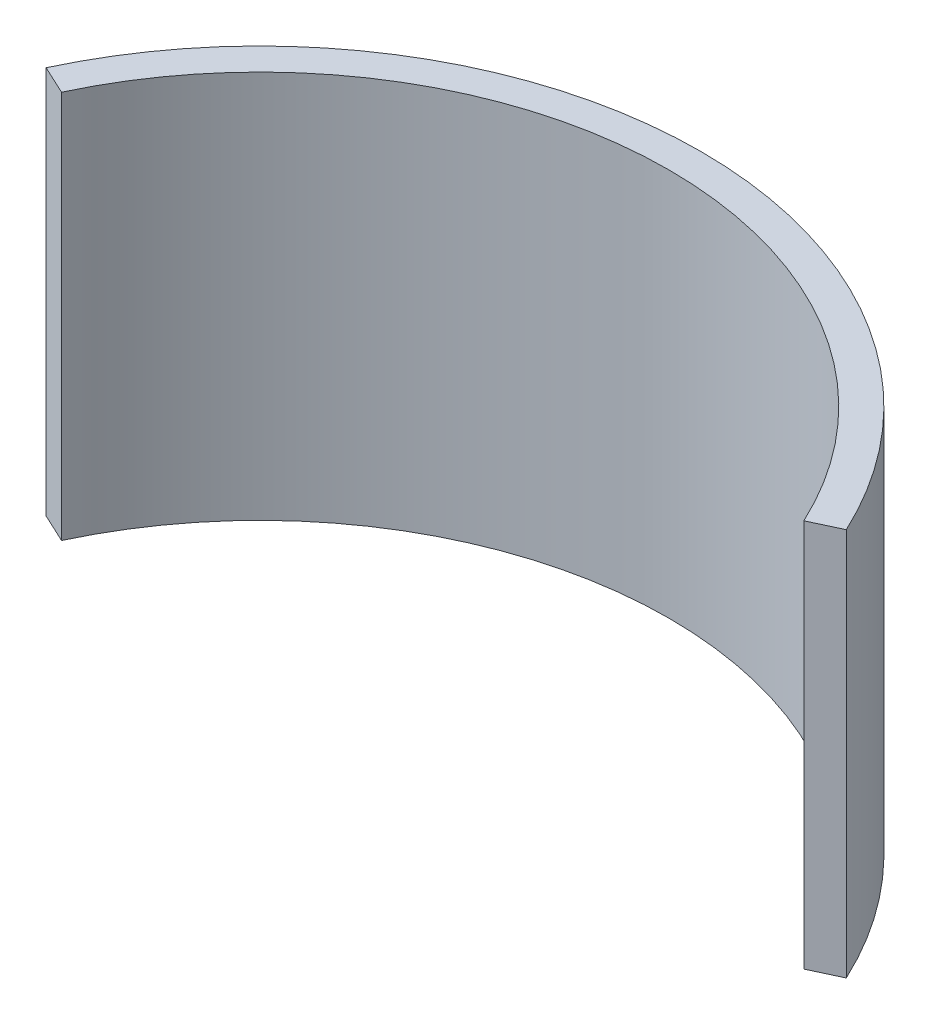
ISO-10303-21;
HEADER;
FILE_DESCRIPTION(('STEP AP214'),'2;1');
FILE_NAME('part.step','',(''),(''),'','','');
FILE_SCHEMA(('AUTOMOTIVE_DESIGN { 1 0 10303 214 1 1 1 1 }'));
ENDSEC;
DATA;
#1=APPLICATION_CONTEXT('core data for automotive mechanical design processes');
#2=APPLICATION_PROTOCOL_DEFINITION('international standard','automotive_design',2000,#1);
#3=PRODUCT_CONTEXT('',#1,'mechanical');
#4=PRODUCT('Part','Part','',(#3));
#5=PRODUCT_RELATED_PRODUCT_CATEGORY('part','',(#4));
#6=PRODUCT_DEFINITION_FORMATION('','',#4);
#7=PRODUCT_DEFINITION_CONTEXT('part definition',#1,'design');
#8=PRODUCT_DEFINITION('design','',#6,#7);
#9=PRODUCT_DEFINITION_SHAPE('','',#8);
#10=(LENGTH_UNIT() NAMED_UNIT(*) SI_UNIT(.MILLI.,.METRE.));
#11=(NAMED_UNIT(*) PLANE_ANGLE_UNIT() SI_UNIT($,.RADIAN.));
#12=(NAMED_UNIT(*) SI_UNIT($,.STERADIAN.) SOLID_ANGLE_UNIT());
#13=UNCERTAINTY_MEASURE_WITH_UNIT(LENGTH_MEASURE(1.E-05),#10,'distance_accuracy_value','');
#14=(GEOMETRIC_REPRESENTATION_CONTEXT(3) GLOBAL_UNCERTAINTY_ASSIGNED_CONTEXT((#13)) GLOBAL_UNIT_ASSIGNED_CONTEXT((#10,
#11,#12)) REPRESENTATION_CONTEXT('',''));
#15=CARTESIAN_POINT('',(0.,0.,0.));
#16=DIRECTION('',(0.,0.,1.));
#17=DIRECTION('',(1.,0.,0.));
#18=AXIS2_PLACEMENT_3D('',#15,#16,#17);
#19=CARTESIAN_POINT('',(0.,51.0988032433773,40.));
#20=DIRECTION('',(0.,1.,0.));
#21=DIRECTION('',(0.,0.,1.));
#22=AXIS2_PLACEMENT_3D('',#19,#20,#21);
#23=CYLINDRICAL_SURFACE('',#22,41.5);
#24=CARTESIAN_POINT('',(0.,18.25,40.));
#25=DIRECTION('',(0.,1.,0.));
#26=DIRECTION('',(0.,0.,1.));
#27=AXIS2_PLACEMENT_3D('',#24,#25,#26);
#28=CIRCLE('',#27,41.5);
#29=CARTESIAN_POINT('',(37.611773162021,18.25,22.4613421377611));
#30=VERTEX_POINT('',#29);
#31=CARTESIAN_POINT('',(-37.611773162021,18.25,22.4613421377611));
#32=VERTEX_POINT('',#31);
#33=EDGE_CURVE('E11',#30,#32,#28,.T.);
#34=ORIENTED_EDGE('',*,*,#33,.F.);
#35=DIRECTION('',(0.,1.,0.));
#36=VECTOR('',#35,1.);
#37=CARTESIAN_POINT('',(37.611773162021,18.25,22.4613421377611));
#38=LINE('',#37,#36);
#39=CARTESIAN_POINT('',(37.611773162021,-18.25,22.4613421377611));
#40=VERTEX_POINT('',#39);
#41=EDGE_CURVE('E106',#40,#30,#38,.T.);
#42=ORIENTED_EDGE('',*,*,#41,.F.);
#43=CARTESIAN_POINT('',(0.,-18.25,40.));
#44=DIRECTION('',(0.,1.,0.));
#45=DIRECTION('',(0.,0.,1.));
#46=AXIS2_PLACEMENT_3D('',#43,#44,#45);
#47=CIRCLE('',#46,41.5);
#48=CARTESIAN_POINT('',(-37.611773162021,-18.25,22.4613421377611));
#49=VERTEX_POINT('',#48);
#50=EDGE_CURVE('E55',#40,#49,#47,.T.);
#51=ORIENTED_EDGE('',*,*,#50,.T.);
#52=DIRECTION('',(0.,1.,0.));
#53=VECTOR('',#52,1.);
#54=CARTESIAN_POINT('',(-37.611773162021,18.25,22.4613421377611));
#55=LINE('',#54,#53);
#56=EDGE_CURVE('E91',#49,#32,#55,.T.);
#57=ORIENTED_EDGE('',*,*,#56,.T.);
#58=EDGE_LOOP('',(#34,#42,#51,#57));
#59=FACE_BOUND('',#58,.T.);
#60=ADVANCED_FACE('F39',(#59),#23,.T.);
#61=CARTESIAN_POINT('',(34.8928498009111,18.25,23.7291969229832));
#62=DIRECTION('',(0.,-1.,0.));
#63=DIRECTION('',(0.,0.,-1.));
#64=AXIS2_PLACEMENT_3D('',#61,#62,#63);
#65=PLANE('',#64);
#66=CARTESIAN_POINT('',(0.,18.25,40.));
#67=DIRECTION('',(0.,1.,0.));
#68=DIRECTION('',(0.,0.,1.));
#69=AXIS2_PLACEMENT_3D('',#66,#67,#68);
#70=CIRCLE('',#69,38.5);
#71=CARTESIAN_POINT('',(34.8928498009111,18.25,23.7291969229832));
#72=VERTEX_POINT('',#71);
#73=CARTESIAN_POINT('',(-34.8928498009111,18.25,23.7291969229832));
#74=VERTEX_POINT('',#73);
#75=EDGE_CURVE('E48',#72,#74,#70,.T.);
#76=ORIENTED_EDGE('',*,*,#75,.F.);
#77=DIRECTION('',(-0.906307787036651,0.,0.422618261740697));
#78=VECTOR('',#77,1.);
#79=CARTESIAN_POINT('',(34.8928498009111,18.25,23.7291969229832));
#80=LINE('',#79,#78);
#81=EDGE_CURVE('E87',#30,#72,#80,.T.);
#82=ORIENTED_EDGE('',*,*,#81,.F.);
#83=ORIENTED_EDGE('',*,*,#33,.T.);
#84=DIRECTION('',(0.906307787036651,0.,0.422618261740697));
#85=VECTOR('',#84,1.);
#86=CARTESIAN_POINT('',(-34.8928498009111,18.25,23.7291969229832));
#87=LINE('',#86,#85);
#88=EDGE_CURVE('E84',#32,#74,#87,.T.);
#89=ORIENTED_EDGE('',*,*,#88,.T.);
#90=EDGE_LOOP('',(#76,#82,#83,#89));
#91=FACE_BOUND('',#90,.T.);
#92=ADVANCED_FACE('F41',(#91),#65,.F.);
#93=CARTESIAN_POINT('',(0.,51.0988032433773,40.));
#94=DIRECTION('',(0.,1.,0.));
#95=DIRECTION('',(0.,0.,1.));
#96=AXIS2_PLACEMENT_3D('',#93,#94,#95);
#97=CYLINDRICAL_SURFACE('',#96,38.5);
#98=CARTESIAN_POINT('',(0.,-18.25,40.));
#99=DIRECTION('',(0.,1.,0.));
#100=DIRECTION('',(0.,0.,1.));
#101=AXIS2_PLACEMENT_3D('',#98,#99,#100);
#102=CIRCLE('',#101,38.5);
#103=CARTESIAN_POINT('',(34.8928498009111,-18.25,23.7291969229831));
#104=VERTEX_POINT('',#103);
#105=CARTESIAN_POINT('',(-34.8928498009111,-18.25,23.7291969229832));
#106=VERTEX_POINT('',#105);
#107=EDGE_CURVE('E63',#104,#106,#102,.T.);
#108=ORIENTED_EDGE('',*,*,#107,.F.);
#109=DIRECTION('',(0.,-1.,0.));
#110=VECTOR('',#109,1.);
#111=CARTESIAN_POINT('',(34.8928498009111,18.25,23.7291969229832));
#112=LINE('',#111,#110);
#113=EDGE_CURVE('E111',#72,#104,#112,.T.);
#114=ORIENTED_EDGE('',*,*,#113,.F.);
#115=ORIENTED_EDGE('',*,*,#75,.T.);
#116=DIRECTION('',(0.,-1.,0.));
#117=VECTOR('',#116,1.);
#118=CARTESIAN_POINT('',(-34.8928498009111,18.25,23.7291969229832));
#119=LINE('',#118,#117);
#120=EDGE_CURVE('E97',#74,#106,#119,.T.);
#121=ORIENTED_EDGE('',*,*,#120,.T.);
#122=EDGE_LOOP('',(#108,#114,#115,#121));
#123=FACE_BOUND('',#122,.T.);
#124=ADVANCED_FACE('F122',(#123),#97,.F.);
#125=CARTESIAN_POINT('',(34.8928498009111,-18.25,23.7291969229831));
#126=DIRECTION('',(0.,1.,0.));
#127=DIRECTION('',(0.,0.,1.));
#128=AXIS2_PLACEMENT_3D('',#125,#126,#127);
#129=PLANE('',#128);
#130=DIRECTION('',(0.906307787036651,0.,-0.422618261740697));
#131=VECTOR('',#130,1.);
#132=CARTESIAN_POINT('',(34.8928498009111,-18.25,23.7291969229831));
#133=LINE('',#132,#131);
#134=EDGE_CURVE('E114',#104,#40,#133,.T.);
#135=ORIENTED_EDGE('',*,*,#134,.F.);
#136=ORIENTED_EDGE('',*,*,#107,.T.);
#137=DIRECTION('',(-0.906307787036651,0.,-0.422618261740697));
#138=VECTOR('',#137,1.);
#139=CARTESIAN_POINT('',(-34.8928498009111,-18.25,23.7291969229832));
#140=LINE('',#139,#138);
#141=EDGE_CURVE('E101',#106,#49,#140,.T.);
#142=ORIENTED_EDGE('',*,*,#141,.T.);
#143=ORIENTED_EDGE('',*,*,#50,.F.);
#144=EDGE_LOOP('',(#135,#136,#142,#143));
#145=FACE_BOUND('',#144,.T.);
#146=ADVANCED_FACE('F125',(#145),#129,.F.);
#147=CARTESIAN_POINT('',(36.252311481466,0.,23.0952695303721));
#148=DIRECTION('',(0.422618261740697,0.,0.906307787036651));
#149=DIRECTION('',(0.906307787036651,0.,-0.422618261740697));
#150=AXIS2_PLACEMENT_3D('',#147,#148,#149);
#151=PLANE('',#150);
#152=ORIENTED_EDGE('',*,*,#41,.T.);
#153=ORIENTED_EDGE('',*,*,#81,.T.);
#154=ORIENTED_EDGE('',*,*,#113,.T.);
#155=ORIENTED_EDGE('',*,*,#134,.T.);
#156=EDGE_LOOP('',(#152,#153,#154,#155));
#157=FACE_BOUND('',#156,.T.);
#158=ADVANCED_FACE('F124',(#157),#151,.T.);
#159=CARTESIAN_POINT('',(-36.252311481466,0.,23.0952695303721));
#160=DIRECTION('',(0.422618261740697,0.,-0.906307787036651));
#161=DIRECTION('',(-0.906307787036651,0.,-0.422618261740697));
#162=AXIS2_PLACEMENT_3D('',#159,#160,#161);
#163=PLANE('',#162);
#164=ORIENTED_EDGE('',*,*,#56,.F.);
#165=ORIENTED_EDGE('',*,*,#141,.F.);
#166=ORIENTED_EDGE('',*,*,#120,.F.);
#167=ORIENTED_EDGE('',*,*,#88,.F.);
#168=EDGE_LOOP('',(#164,#165,#166,#167));
#169=FACE_BOUND('',#168,.T.);
#170=ADVANCED_FACE('F96',(#169),#163,.F.);
#171=CLOSED_SHELL('',(#60,#92,#124,#146,#158,#170));
#172=MANIFOLD_SOLID_BREP('B2',#171);
#173=ADVANCED_BREP_SHAPE_REPRESENTATION('',(#18,#172),#14);
#174=SHAPE_DEFINITION_REPRESENTATION(#9,#173);
ENDSEC;
END-ISO-10303-21;
